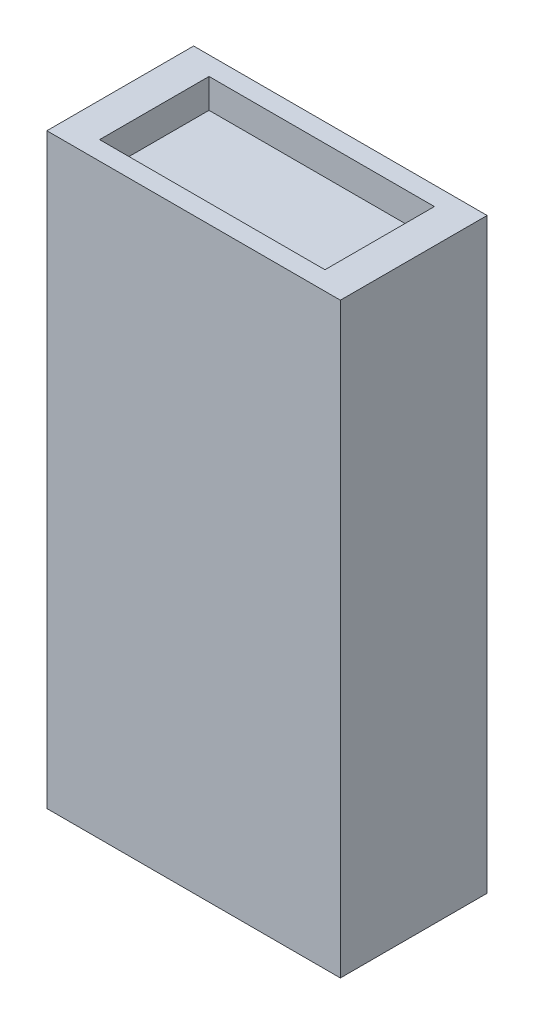
ISO-10303-21;
HEADER;
FILE_DESCRIPTION(('STEP AP214'),'2;1');
FILE_NAME('part.step','',(''),(''),'','','');
FILE_SCHEMA(('AUTOMOTIVE_DESIGN { 1 0 10303 214 1 1 1 1 }'));
ENDSEC;
DATA;
#1=APPLICATION_CONTEXT('core data for automotive mechanical design processes');
#2=APPLICATION_PROTOCOL_DEFINITION('international standard','automotive_design',2000,#1);
#3=PRODUCT_CONTEXT('',#1,'mechanical');
#4=PRODUCT('Part','Part','',(#3));
#5=PRODUCT_RELATED_PRODUCT_CATEGORY('part','',(#4));
#6=PRODUCT_DEFINITION_FORMATION('','',#4);
#7=PRODUCT_DEFINITION_CONTEXT('part definition',#1,'design');
#8=PRODUCT_DEFINITION('design','',#6,#7);
#9=PRODUCT_DEFINITION_SHAPE('','',#8);
#10=(LENGTH_UNIT() NAMED_UNIT(*) SI_UNIT(.MILLI.,.METRE.));
#11=(NAMED_UNIT(*) PLANE_ANGLE_UNIT() SI_UNIT($,.RADIAN.));
#12=(NAMED_UNIT(*) SI_UNIT($,.STERADIAN.) SOLID_ANGLE_UNIT());
#13=UNCERTAINTY_MEASURE_WITH_UNIT(LENGTH_MEASURE(1.E-05),#10,'distance_accuracy_value','');
#14=(GEOMETRIC_REPRESENTATION_CONTEXT(3) GLOBAL_UNCERTAINTY_ASSIGNED_CONTEXT((#13)) GLOBAL_UNIT_ASSIGNED_CONTEXT((#10,
#11,#12)) REPRESENTATION_CONTEXT('',''));
#15=CARTESIAN_POINT('',(0.,0.,0.));
#16=DIRECTION('',(0.,0.,1.));
#17=DIRECTION('',(1.,0.,0.));
#18=AXIS2_PLACEMENT_3D('',#15,#16,#17);
#19=CARTESIAN_POINT('',(9.99999999999984,19.9999999999999,9.99999999999779));
#20=DIRECTION('',(-1.00000000000001,0.,0.));
#21=DIRECTION('',(0.,-1.00000000000001,0.));
#22=AXIS2_PLACEMENT_3D('',#19,#20,#21);
#23=PLANE('',#22);
#24=DIRECTION('',(0.,1.00000000000001,0.));
#25=VECTOR('',#24,1.);
#26=CARTESIAN_POINT('',(10.,20.,-2.22044604925031E-12));
#27=LINE('',#26,#25);
#28=CARTESIAN_POINT('',(10.,-20.0000000000001,-2.22044604925031E-12));
#29=VERTEX_POINT('',#28);
#30=CARTESIAN_POINT('',(10.,20.,-2.22044604925031E-12));
#31=VERTEX_POINT('',#30);
#32=EDGE_CURVE('E167',#29,#31,#27,.T.);
#33=ORIENTED_EDGE('',*,*,#32,.T.);
#34=DIRECTION('',(0.,0.,-1.));
#35=VECTOR('',#34,1.);
#36=CARTESIAN_POINT('',(9.99999999999984,19.9999999999999,9.99999999999779));
#37=LINE('',#36,#35);
#38=CARTESIAN_POINT('',(9.99999999999984,19.9999999999999,9.99999999999779));
#39=VERTEX_POINT('',#38);
#40=EDGE_CURVE('E11',#39,#31,#37,.T.);
#41=ORIENTED_EDGE('',*,*,#40,.F.);
#42=DIRECTION('',(0.,1.00000000000001,0.));
#43=VECTOR('',#42,1.);
#44=CARTESIAN_POINT('',(9.99999999999984,19.9999999999999,9.99999999999779));
#45=LINE('',#44,#43);
#46=CARTESIAN_POINT('',(9.9999999999989,-20.,9.99999999999779));
#47=VERTEX_POINT('',#46);
#48=EDGE_CURVE('E173',#47,#39,#45,.T.);
#49=ORIENTED_EDGE('',*,*,#48,.F.);
#50=DIRECTION('',(0.,0.,-1.));
#51=VECTOR('',#50,1.);
#52=CARTESIAN_POINT('',(9.9999999999989,-20.,9.99999999999779));
#53=LINE('',#52,#51);
#54=EDGE_CURVE('E183',#47,#29,#53,.T.);
#55=ORIENTED_EDGE('',*,*,#54,.T.);
#56=EDGE_LOOP('',(#33,#41,#49,#55));
#57=FACE_BOUND('',#56,.T.);
#58=ADVANCED_FACE('F47',(#57),#23,.F.);
#59=CARTESIAN_POINT('',(-10.0000000000011,20.,10.));
#60=DIRECTION('',(0.,-1.00000000000001,0.));
#61=DIRECTION('',(0.,0.,-1.));
#62=AXIS2_PLACEMENT_3D('',#59,#60,#61);
#63=PLANE('',#62);
#64=DIRECTION('',(-1.00000000000001,0.,0.));
#65=VECTOR('',#64,1.);
#66=CARTESIAN_POINT('',(-7.67851991852631,20.,1.27182170320916));
#67=LINE('',#66,#65);
#68=CARTESIAN_POINT('',(7.67851991852414,20.,1.27182170321138));
#69=VERTEX_POINT('',#68);
#70=CARTESIAN_POINT('',(-7.67851991852631,20.,1.27182170320916));
#71=VERTEX_POINT('',#70);
#72=EDGE_CURVE('E158',#69,#71,#67,.T.);
#73=ORIENTED_EDGE('',*,*,#72,.F.);
#74=DIRECTION('',(0.,0.,-1.));
#75=VECTOR('',#74,1.);
#76=CARTESIAN_POINT('',(7.67851991852525,20.,8.72817829678851));
#77=LINE('',#76,#75);
#78=CARTESIAN_POINT('',(7.67851991852525,20.,8.72817829678851));
#79=VERTEX_POINT('',#78);
#80=EDGE_CURVE('E62',#79,#69,#77,.T.);
#81=ORIENTED_EDGE('',*,*,#80,.F.);
#82=DIRECTION('',(1.00000000000001,0.,0.));
#83=VECTOR('',#82,1.);
#84=CARTESIAN_POINT('',(-7.6785199185252,20.,8.7281782967864));
#85=LINE('',#84,#83);
#86=CARTESIAN_POINT('',(-7.6785199185252,20.,8.7281782967864));
#87=VERTEX_POINT('',#86);
#88=EDGE_CURVE('E144',#87,#79,#85,.T.);
#89=ORIENTED_EDGE('',*,*,#88,.F.);
#90=DIRECTION('',(0.,0.,1.));
#91=VECTOR('',#90,1.);
#92=CARTESIAN_POINT('',(-7.6785199185252,20.,8.7281782967864));
#93=LINE('',#92,#91);
#94=EDGE_CURVE('E149',#71,#87,#93,.T.);
#95=ORIENTED_EDGE('',*,*,#94,.F.);
#96=EDGE_LOOP('',(#73,#81,#89,#95));
#97=FACE_BOUND('',#96,.T.);
#98=DIRECTION('',(-1.00000000000001,0.,0.));
#99=VECTOR('',#98,1.);
#100=CARTESIAN_POINT('',(-10.,20.,0.));
#101=LINE('',#100,#99);
#102=CARTESIAN_POINT('',(-10.,20.,0.));
#103=VERTEX_POINT('',#102);
#104=EDGE_CURVE('E187',#31,#103,#101,.T.);
#105=ORIENTED_EDGE('',*,*,#104,.T.);
#106=DIRECTION('',(0.,0.,-1.));
#107=VECTOR('',#106,1.);
#108=CARTESIAN_POINT('',(-10.0000000000011,20.,10.));
#109=LINE('',#108,#107);
#110=CARTESIAN_POINT('',(-10.0000000000011,20.,10.));
#111=VERTEX_POINT('',#110);
#112=EDGE_CURVE('E55',#111,#103,#109,.T.);
#113=ORIENTED_EDGE('',*,*,#112,.F.);
#114=DIRECTION('',(-1.00000000000001,0.,0.));
#115=VECTOR('',#114,1.);
#116=CARTESIAN_POINT('',(-10.0000000000011,20.,10.));
#117=LINE('',#116,#115);
#118=EDGE_CURVE('E99',#39,#111,#117,.T.);
#119=ORIENTED_EDGE('',*,*,#118,.F.);
#120=ORIENTED_EDGE('',*,*,#40,.T.);
#121=EDGE_LOOP('',(#105,#113,#119,#120));
#122=FACE_BOUND('',#121,.T.);
#123=ADVANCED_FACE('F222',(#97,#122),#63,.F.);
#124=CARTESIAN_POINT('',(-10.0000000000011,20.,10.));
#125=DIRECTION('',(1.00000000000001,0.,0.));
#126=DIRECTION('',(0.,1.00000000000001,0.));
#127=AXIS2_PLACEMENT_3D('',#124,#125,#126);
#128=PLANE('',#127);
#129=DIRECTION('',(0.,-1.00000000000001,0.));
#130=VECTOR('',#129,1.);
#131=CARTESIAN_POINT('',(-10.,20.,0.));
#132=LINE('',#131,#130);
#133=CARTESIAN_POINT('',(-10.,-20.0000000000001,0.));
#134=VERTEX_POINT('',#133);
#135=EDGE_CURVE('E190',#103,#134,#132,.T.);
#136=ORIENTED_EDGE('',*,*,#135,.T.);
#137=DIRECTION('',(0.,0.,-1.));
#138=VECTOR('',#137,1.);
#139=CARTESIAN_POINT('',(-10.0000000000011,-20.,10.));
#140=LINE('',#139,#138);
#141=CARTESIAN_POINT('',(-10.0000000000011,-20.,10.));
#142=VERTEX_POINT('',#141);
#143=EDGE_CURVE('E197',#142,#134,#140,.T.);
#144=ORIENTED_EDGE('',*,*,#143,.F.);
#145=DIRECTION('',(0.,-1.00000000000001,0.));
#146=VECTOR('',#145,1.);
#147=CARTESIAN_POINT('',(-10.0000000000011,20.,10.));
#148=LINE('',#147,#146);
#149=EDGE_CURVE('E178',#111,#142,#148,.T.);
#150=ORIENTED_EDGE('',*,*,#149,.F.);
#151=ORIENTED_EDGE('',*,*,#112,.T.);
#152=EDGE_LOOP('',(#136,#144,#150,#151));
#153=FACE_BOUND('',#152,.T.);
#154=ADVANCED_FACE('F205',(#153),#128,.F.);
#155=CARTESIAN_POINT('',(-10.0000000000011,-20.,10.));
#156=DIRECTION('',(0.,1.00000000000001,0.));
#157=DIRECTION('',(0.,0.,1.));
#158=AXIS2_PLACEMENT_3D('',#155,#156,#157);
#159=PLANE('',#158);
#160=DIRECTION('',(1.00000000000001,0.,0.));
#161=VECTOR('',#160,1.);
#162=CARTESIAN_POINT('',(-10.,-20.0000000000001,0.));
#163=LINE('',#162,#161);
#164=EDGE_CURVE('E92',#134,#29,#163,.T.);
#165=ORIENTED_EDGE('',*,*,#164,.T.);
#166=ORIENTED_EDGE('',*,*,#54,.F.);
#167=DIRECTION('',(1.00000000000001,0.,0.));
#168=VECTOR('',#167,1.);
#169=CARTESIAN_POINT('',(-10.0000000000011,-20.,10.));
#170=LINE('',#169,#168);
#171=EDGE_CURVE('E71',#142,#47,#170,.T.);
#172=ORIENTED_EDGE('',*,*,#171,.F.);
#173=ORIENTED_EDGE('',*,*,#143,.T.);
#174=EDGE_LOOP('',(#165,#166,#172,#173));
#175=FACE_BOUND('',#174,.T.);
#176=ADVANCED_FACE('F213',(#175),#159,.F.);
#177=CARTESIAN_POINT('',(-1.11022302462516E-12,0.,10.));
#178=DIRECTION('',(0.,0.,1.));
#179=DIRECTION('',(1.00000000000001,0.,0.));
#180=AXIS2_PLACEMENT_3D('',#177,#178,#179);
#181=PLANE('',#180);
#182=ORIENTED_EDGE('',*,*,#48,.T.);
#183=ORIENTED_EDGE('',*,*,#118,.T.);
#184=ORIENTED_EDGE('',*,*,#149,.T.);
#185=ORIENTED_EDGE('',*,*,#171,.T.);
#186=EDGE_LOOP('',(#182,#183,#184,#185));
#187=FACE_BOUND('',#186,.T.);
#188=ADVANCED_FACE('F215',(#187),#181,.T.);
#189=CARTESIAN_POINT('',(0.,0.,0.));
#190=DIRECTION('',(0.,0.,1.));
#191=DIRECTION('',(1.00000000000001,0.,0.));
#192=AXIS2_PLACEMENT_3D('',#189,#190,#191);
#193=PLANE('',#192);
#194=ORIENTED_EDGE('',*,*,#32,.F.);
#195=ORIENTED_EDGE('',*,*,#164,.F.);
#196=ORIENTED_EDGE('',*,*,#135,.F.);
#197=ORIENTED_EDGE('',*,*,#104,.F.);
#198=EDGE_LOOP('',(#194,#195,#196,#197));
#199=FACE_BOUND('',#198,.T.);
#200=ADVANCED_FACE('F209',(#199),#193,.F.);
#201=CARTESIAN_POINT('',(7.6785199185252,18.,8.72817829678862));
#202=DIRECTION('',(1.00000000000001,0.,0.));
#203=DIRECTION('',(0.,0.,-1.));
#204=AXIS2_PLACEMENT_3D('',#201,#202,#203);
#205=PLANE('',#204);
#206=ORIENTED_EDGE('',*,*,#80,.T.);
#207=DIRECTION('',(0.,1.00000000000001,0.));
#208=VECTOR('',#207,1.);
#209=CARTESIAN_POINT('',(7.67851991852408,18.,1.27182170321138));
#210=LINE('',#209,#208);
#211=CARTESIAN_POINT('',(7.67851991852408,18.,1.27182170321138));
#212=VERTEX_POINT('',#211);
#213=EDGE_CURVE('E119',#212,#69,#210,.T.);
#214=ORIENTED_EDGE('',*,*,#213,.F.);
#215=DIRECTION('',(0.,0.,-1.));
#216=VECTOR('',#215,1.);
#217=CARTESIAN_POINT('',(7.6785199185252,18.,8.72817829678862));
#218=LINE('',#217,#216);
#219=CARTESIAN_POINT('',(7.6785199185252,18.,8.72817829678862));
#220=VERTEX_POINT('',#219);
#221=EDGE_CURVE('E123',#220,#212,#218,.T.);
#222=ORIENTED_EDGE('',*,*,#221,.F.);
#223=DIRECTION('',(0.,1.00000000000001,0.));
#224=VECTOR('',#223,1.);
#225=CARTESIAN_POINT('',(7.6785199185252,18.,8.72817829678862));
#226=LINE('',#225,#224);
#227=EDGE_CURVE('E164',#220,#79,#226,.T.);
#228=ORIENTED_EDGE('',*,*,#227,.T.);
#229=EDGE_LOOP('',(#206,#214,#222,#228));
#230=FACE_BOUND('',#229,.T.);
#231=ADVANCED_FACE('F121',(#230),#205,.F.);
#232=CARTESIAN_POINT('',(-7.67851991852525,18.,8.72817829678862));
#233=DIRECTION('',(0.,0.,1.));
#234=DIRECTION('',(1.00000000000001,0.,0.));
#235=AXIS2_PLACEMENT_3D('',#232,#233,#234);
#236=PLANE('',#235);
#237=ORIENTED_EDGE('',*,*,#88,.T.);
#238=ORIENTED_EDGE('',*,*,#227,.F.);
#239=DIRECTION('',(1.00000000000001,0.,0.));
#240=VECTOR('',#239,1.);
#241=CARTESIAN_POINT('',(-7.67851991852525,18.,8.72817829678862));
#242=LINE('',#241,#240);
#243=CARTESIAN_POINT('',(-7.67851991852525,18.,8.72817829678862));
#244=VERTEX_POINT('',#243);
#245=EDGE_CURVE('E130',#244,#220,#242,.T.);
#246=ORIENTED_EDGE('',*,*,#245,.F.);
#247=DIRECTION('',(0.,1.00000000000001,0.));
#248=VECTOR('',#247,1.);
#249=CARTESIAN_POINT('',(-7.67851991852525,18.,8.72817829678862));
#250=LINE('',#249,#248);
#251=EDGE_CURVE('E168',#244,#87,#250,.T.);
#252=ORIENTED_EDGE('',*,*,#251,.T.);
#253=EDGE_LOOP('',(#237,#238,#246,#252));
#254=FACE_BOUND('',#253,.T.);
#255=ADVANCED_FACE('F240',(#254),#236,.F.);
#256=CARTESIAN_POINT('',(-7.67851991852525,18.,8.72817829678862));
#257=DIRECTION('',(-1.00000000000001,0.,0.));
#258=DIRECTION('',(0.,0.,1.));
#259=AXIS2_PLACEMENT_3D('',#256,#257,#258);
#260=PLANE('',#259);
#261=ORIENTED_EDGE('',*,*,#94,.T.);
#262=ORIENTED_EDGE('',*,*,#251,.F.);
#263=DIRECTION('',(0.,0.,1.));
#264=VECTOR('',#263,1.);
#265=CARTESIAN_POINT('',(-7.67851991852525,18.,8.72817829678862));
#266=LINE('',#265,#264);
#267=CARTESIAN_POINT('',(-7.67851991852636,18.,1.27182170321138));
#268=VERTEX_POINT('',#267);
#269=EDGE_CURVE('E139',#268,#244,#266,.T.);
#270=ORIENTED_EDGE('',*,*,#269,.F.);
#271=DIRECTION('',(0.,1.00000000000001,0.));
#272=VECTOR('',#271,1.);
#273=CARTESIAN_POINT('',(-7.67851991852636,18.,1.27182170321138));
#274=LINE('',#273,#272);
#275=EDGE_CURVE('E129',#268,#71,#274,.T.);
#276=ORIENTED_EDGE('',*,*,#275,.T.);
#277=EDGE_LOOP('',(#261,#262,#270,#276));
#278=FACE_BOUND('',#277,.T.);
#279=ADVANCED_FACE('F238',(#278),#260,.F.);
#280=CARTESIAN_POINT('',(-7.67851991852636,18.,1.27182170321138));
#281=DIRECTION('',(0.,0.,-1.));
#282=DIRECTION('',(-1.00000000000001,0.,0.));
#283=AXIS2_PLACEMENT_3D('',#280,#281,#282);
#284=PLANE('',#283);
#285=ORIENTED_EDGE('',*,*,#72,.T.);
#286=ORIENTED_EDGE('',*,*,#275,.F.);
#287=DIRECTION('',(-1.00000000000001,0.,0.));
#288=VECTOR('',#287,1.);
#289=CARTESIAN_POINT('',(-7.67851991852636,18.,1.27182170321138));
#290=LINE('',#289,#288);
#291=EDGE_CURVE('E133',#212,#268,#290,.T.);
#292=ORIENTED_EDGE('',*,*,#291,.F.);
#293=ORIENTED_EDGE('',*,*,#213,.T.);
#294=EDGE_LOOP('',(#285,#286,#292,#293));
#295=FACE_BOUND('',#294,.T.);
#296=ADVANCED_FACE('F134',(#295),#284,.F.);
#297=CARTESIAN_POINT('',(0.,18.,0.));
#298=DIRECTION('',(0.,-1.00000000000001,0.));
#299=DIRECTION('',(0.,0.,-1.));
#300=AXIS2_PLACEMENT_3D('',#297,#298,#299);
#301=PLANE('',#300);
#302=ORIENTED_EDGE('',*,*,#221,.T.);
#303=ORIENTED_EDGE('',*,*,#291,.T.);
#304=ORIENTED_EDGE('',*,*,#269,.T.);
#305=ORIENTED_EDGE('',*,*,#245,.T.);
#306=EDGE_LOOP('',(#302,#303,#304,#305));
#307=FACE_BOUND('',#306,.T.);
#308=ADVANCED_FACE('F141',(#307),#301,.F.);
#309=CLOSED_SHELL('',(#58,#123,#154,#176,#188,#200,#231,#255,#279,#296,#308));
#310=MANIFOLD_SOLID_BREP('B2',#309);
#311=ADVANCED_BREP_SHAPE_REPRESENTATION('',(#18,#310),#14);
#312=SHAPE_DEFINITION_REPRESENTATION(#9,#311);
ENDSEC;
END-ISO-10303-21;
